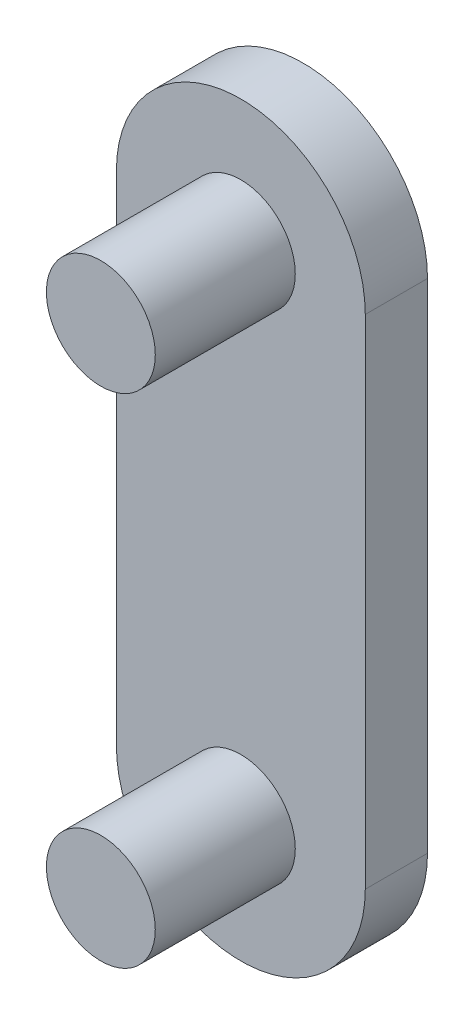
ISO-10303-21;
HEADER;
FILE_DESCRIPTION(('STEP AP214'),'2;1');
FILE_NAME('part.step','',(''),(''),'','','');
FILE_SCHEMA(('AUTOMOTIVE_DESIGN { 1 0 10303 214 1 1 1 1 }'));
ENDSEC;
DATA;
#1=APPLICATION_CONTEXT('core data for automotive mechanical design processes');
#2=APPLICATION_PROTOCOL_DEFINITION('international standard','automotive_design',2000,#1);
#3=PRODUCT_CONTEXT('',#1,'mechanical');
#4=PRODUCT('Part','Part','',(#3));
#5=PRODUCT_RELATED_PRODUCT_CATEGORY('part','',(#4));
#6=PRODUCT_DEFINITION_FORMATION('','',#4);
#7=PRODUCT_DEFINITION_CONTEXT('part definition',#1,'design');
#8=PRODUCT_DEFINITION('design','',#6,#7);
#9=PRODUCT_DEFINITION_SHAPE('','',#8);
#10=(LENGTH_UNIT() NAMED_UNIT(*) SI_UNIT(.MILLI.,.METRE.));
#11=(NAMED_UNIT(*) PLANE_ANGLE_UNIT() SI_UNIT($,.RADIAN.));
#12=(NAMED_UNIT(*) SI_UNIT($,.STERADIAN.) SOLID_ANGLE_UNIT());
#13=UNCERTAINTY_MEASURE_WITH_UNIT(LENGTH_MEASURE(1.E-05),#10,'distance_accuracy_value','');
#14=(GEOMETRIC_REPRESENTATION_CONTEXT(3) GLOBAL_UNCERTAINTY_ASSIGNED_CONTEXT((#13)) GLOBAL_UNIT_ASSIGNED_CONTEXT((#10,
#11,#12)) REPRESENTATION_CONTEXT('',''));
#15=CARTESIAN_POINT('',(0.,0.,0.));
#16=DIRECTION('',(0.,0.,1.));
#17=DIRECTION('',(1.,0.,0.));
#18=AXIS2_PLACEMENT_3D('',#15,#16,#17);
#19=CARTESIAN_POINT('',(-4.,0.,-2.));
#20=DIRECTION('',(-1.,0.,0.));
#21=DIRECTION('',(0.,-1.,0.));
#22=AXIS2_PLACEMENT_3D('',#19,#20,#21);
#23=PLANE('',#22);
#24=DIRECTION('',(0.,-1.,0.));
#25=VECTOR('',#24,1.);
#26=CARTESIAN_POINT('',(-4.,0.,0.));
#27=LINE('',#26,#25);
#28=CARTESIAN_POINT('',(-4.,0.,0.));
#29=VERTEX_POINT('',#28);
#30=CARTESIAN_POINT('',(-4.,-16.,0.));
#31=VERTEX_POINT('',#30);
#32=EDGE_CURVE('E134',#29,#31,#27,.T.);
#33=ORIENTED_EDGE('',*,*,#32,.F.);
#34=DIRECTION('',(0.,0.,1.));
#35=VECTOR('',#34,1.);
#36=CARTESIAN_POINT('',(-4.,0.,-2.));
#37=LINE('',#36,#35);
#38=CARTESIAN_POINT('',(-4.,0.,-2.));
#39=VERTEX_POINT('',#38);
#40=EDGE_CURVE('E12',#39,#29,#37,.T.);
#41=ORIENTED_EDGE('',*,*,#40,.F.);
#42=DIRECTION('',(0.,-1.,0.));
#43=VECTOR('',#42,1.);
#44=CARTESIAN_POINT('',(-4.,0.,-2.));
#45=LINE('',#44,#43);
#46=CARTESIAN_POINT('',(-4.,-16.,-2.));
#47=VERTEX_POINT('',#46);
#48=EDGE_CURVE('E128',#39,#47,#45,.T.);
#49=ORIENTED_EDGE('',*,*,#48,.T.);
#50=DIRECTION('',(0.,0.,1.));
#51=VECTOR('',#50,1.);
#52=CARTESIAN_POINT('',(-4.,-16.,-2.));
#53=LINE('',#52,#51);
#54=EDGE_CURVE('E106',#47,#31,#53,.T.);
#55=ORIENTED_EDGE('',*,*,#54,.T.);
#56=EDGE_LOOP('',(#33,#41,#49,#55));
#57=FACE_BOUND('',#56,.T.);
#58=ADVANCED_FACE('F62',(#57),#23,.T.);
#59=CARTESIAN_POINT('',(4.,0.,-2.));
#60=DIRECTION('',(-1.,0.,0.));
#61=DIRECTION('',(0.,-1.,0.));
#62=AXIS2_PLACEMENT_3D('',#59,#60,#61);
#63=PLANE('',#62);
#64=DIRECTION('',(0.,-1.,0.));
#65=VECTOR('',#64,1.);
#66=CARTESIAN_POINT('',(4.,0.,0.));
#67=LINE('',#66,#65);
#68=CARTESIAN_POINT('',(4.,0.,0.));
#69=VERTEX_POINT('',#68);
#70=CARTESIAN_POINT('',(4.,-16.,0.));
#71=VERTEX_POINT('',#70);
#72=EDGE_CURVE('E122',#69,#71,#67,.T.);
#73=ORIENTED_EDGE('',*,*,#72,.T.);
#74=DIRECTION('',(0.,0.,1.));
#75=VECTOR('',#74,1.);
#76=CARTESIAN_POINT('',(4.,-16.,-2.));
#77=LINE('',#76,#75);
#78=CARTESIAN_POINT('',(4.,-16.,-2.));
#79=VERTEX_POINT('',#78);
#80=EDGE_CURVE('E119',#79,#71,#77,.T.);
#81=ORIENTED_EDGE('',*,*,#80,.F.);
#82=DIRECTION('',(0.,-1.,0.));
#83=VECTOR('',#82,1.);
#84=CARTESIAN_POINT('',(4.,0.,-2.));
#85=LINE('',#84,#83);
#86=CARTESIAN_POINT('',(4.,0.,-2.));
#87=VERTEX_POINT('',#86);
#88=EDGE_CURVE('E111',#87,#79,#85,.T.);
#89=ORIENTED_EDGE('',*,*,#88,.F.);
#90=DIRECTION('',(0.,0.,1.));
#91=VECTOR('',#90,1.);
#92=CARTESIAN_POINT('',(4.,0.,-2.));
#93=LINE('',#92,#91);
#94=EDGE_CURVE('E73',#87,#69,#93,.T.);
#95=ORIENTED_EDGE('',*,*,#94,.T.);
#96=EDGE_LOOP('',(#73,#81,#89,#95));
#97=FACE_BOUND('',#96,.T.);
#98=ADVANCED_FACE('F120',(#97),#63,.F.);
#99=CARTESIAN_POINT('',(0.,-16.,-2.));
#100=DIRECTION('',(0.,0.,1.));
#101=DIRECTION('',(1.,0.,0.));
#102=AXIS2_PLACEMENT_3D('',#99,#100,#101);
#103=CYLINDRICAL_SURFACE('',#102,4.);
#104=CARTESIAN_POINT('',(0.,-16.,0.));
#105=DIRECTION('',(0.,0.,1.));
#106=DIRECTION('',(1.,0.,0.));
#107=AXIS2_PLACEMENT_3D('',#104,#105,#106);
#108=CIRCLE('',#107,4.);
#109=EDGE_CURVE('E138',#31,#71,#108,.T.);
#110=ORIENTED_EDGE('',*,*,#109,.F.);
#111=ORIENTED_EDGE('',*,*,#54,.F.);
#112=CARTESIAN_POINT('',(0.,-16.,-2.));
#113=DIRECTION('',(0.,0.,1.));
#114=DIRECTION('',(1.,0.,0.));
#115=AXIS2_PLACEMENT_3D('',#112,#113,#114);
#116=CIRCLE('',#115,4.);
#117=EDGE_CURVE('E115',#47,#79,#116,.T.);
#118=ORIENTED_EDGE('',*,*,#117,.T.);
#119=ORIENTED_EDGE('',*,*,#80,.T.);
#120=EDGE_LOOP('',(#110,#111,#118,#119));
#121=FACE_BOUND('',#120,.T.);
#122=ADVANCED_FACE('F126',(#121),#103,.T.);
#123=CARTESIAN_POINT('',(0.,0.,-2.));
#124=DIRECTION('',(0.,0.,1.));
#125=DIRECTION('',(1.,0.,0.));
#126=AXIS2_PLACEMENT_3D('',#123,#124,#125);
#127=PLANE('',#126);
#128=ORIENTED_EDGE('',*,*,#48,.F.);
#129=CARTESIAN_POINT('',(0.,0.,-2.));
#130=DIRECTION('',(0.,0.,1.));
#131=DIRECTION('',(1.,0.,0.));
#132=AXIS2_PLACEMENT_3D('',#129,#130,#131);
#133=CIRCLE('',#132,4.);
#134=EDGE_CURVE('E116',#87,#39,#133,.T.);
#135=ORIENTED_EDGE('',*,*,#134,.F.);
#136=ORIENTED_EDGE('',*,*,#88,.T.);
#137=ORIENTED_EDGE('',*,*,#117,.F.);
#138=EDGE_LOOP('',(#128,#135,#136,#137));
#139=FACE_BOUND('',#138,.T.);
#140=ADVANCED_FACE('F114',(#139),#127,.F.);
#141=CARTESIAN_POINT('',(0.,0.,0.));
#142=DIRECTION('',(0.,0.,1.));
#143=DIRECTION('',(1.,0.,0.));
#144=AXIS2_PLACEMENT_3D('',#141,#142,#143);
#145=PLANE('',#144);
#146=CARTESIAN_POINT('',(0.,-16.,0.));
#147=DIRECTION('',(0.,0.,1.));
#148=DIRECTION('',(1.,0.,0.));
#149=AXIS2_PLACEMENT_3D('',#146,#147,#148);
#150=CIRCLE('',#149,1.75);
#151=CARTESIAN_POINT('',(1.75,-16.,0.));
#152=VERTEX_POINT('',#151);
#153=EDGE_CURVE('E160',#152,#152,#150,.T.);
#154=ORIENTED_EDGE('',*,*,#153,.F.);
#155=EDGE_LOOP('',(#154));
#156=FACE_BOUND('',#155,.T.);
#157=CARTESIAN_POINT('',(0.,0.,0.));
#158=DIRECTION('',(0.,0.,1.));
#159=DIRECTION('',(1.,0.,0.));
#160=AXIS2_PLACEMENT_3D('',#157,#158,#159);
#161=CIRCLE('',#160,1.75);
#162=CARTESIAN_POINT('',(1.75,0.,0.));
#163=VERTEX_POINT('',#162);
#164=EDGE_CURVE('E152',#163,#163,#161,.T.);
#165=ORIENTED_EDGE('',*,*,#164,.F.);
#166=EDGE_LOOP('',(#165));
#167=FACE_BOUND('',#166,.T.);
#168=ORIENTED_EDGE('',*,*,#32,.T.);
#169=ORIENTED_EDGE('',*,*,#109,.T.);
#170=ORIENTED_EDGE('',*,*,#72,.F.);
#171=CARTESIAN_POINT('',(0.,0.,0.));
#172=DIRECTION('',(0.,0.,1.));
#173=DIRECTION('',(1.,0.,0.));
#174=AXIS2_PLACEMENT_3D('',#171,#172,#173);
#175=CIRCLE('',#174,4.);
#176=EDGE_CURVE('E66',#69,#29,#175,.T.);
#177=ORIENTED_EDGE('',*,*,#176,.T.);
#178=EDGE_LOOP('',(#168,#169,#170,#177));
#179=FACE_BOUND('',#178,.T.);
#180=ADVANCED_FACE('F177',(#156,#167,#179),#145,.T.);
#181=CARTESIAN_POINT('',(0.,0.,-2.));
#182=DIRECTION('',(0.,0.,1.));
#183=DIRECTION('',(1.,0.,0.));
#184=AXIS2_PLACEMENT_3D('',#181,#182,#183);
#185=CYLINDRICAL_SURFACE('',#184,4.);
#186=ORIENTED_EDGE('',*,*,#134,.T.);
#187=ORIENTED_EDGE('',*,*,#40,.T.);
#188=ORIENTED_EDGE('',*,*,#176,.F.);
#189=ORIENTED_EDGE('',*,*,#94,.F.);
#190=EDGE_LOOP('',(#186,#187,#188,#189));
#191=FACE_BOUND('',#190,.T.);
#192=ADVANCED_FACE('F64',(#191),#185,.T.);
#193=CARTESIAN_POINT('',(0.,0.,4.5));
#194=DIRECTION('',(0.,0.,-1.));
#195=DIRECTION('',(-1.,0.,0.));
#196=AXIS2_PLACEMENT_3D('',#193,#194,#195);
#197=CYLINDRICAL_SURFACE('',#196,1.75);
#198=CARTESIAN_POINT('',(0.,0.,4.5));
#199=DIRECTION('',(0.,0.,1.));
#200=DIRECTION('',(1.,0.,0.));
#201=AXIS2_PLACEMENT_3D('',#198,#199,#200);
#202=CIRCLE('',#201,1.75);
#203=CARTESIAN_POINT('',(1.75,0.,4.5));
#204=VERTEX_POINT('',#203);
#205=EDGE_CURVE('E148',#204,#204,#202,.T.);
#206=ORIENTED_EDGE('',*,*,#205,.F.);
#207=EDGE_LOOP('',(#206));
#208=FACE_BOUND('',#207,.T.);
#209=ORIENTED_EDGE('',*,*,#164,.T.);
#210=EDGE_LOOP('',(#209));
#211=FACE_BOUND('',#210,.T.);
#212=ADVANCED_FACE('F181',(#208,#211),#197,.T.);
#213=CARTESIAN_POINT('',(0.,0.,4.5));
#214=DIRECTION('',(0.,0.,1.));
#215=DIRECTION('',(1.,0.,0.));
#216=AXIS2_PLACEMENT_3D('',#213,#214,#215);
#217=PLANE('',#216);
#218=ORIENTED_EDGE('',*,*,#205,.T.);
#219=EDGE_LOOP('',(#218));
#220=FACE_BOUND('',#219,.T.);
#221=ADVANCED_FACE('F173',(#220),#217,.T.);
#222=CARTESIAN_POINT('',(0.,-16.,4.5));
#223=DIRECTION('',(0.,0.,-1.));
#224=DIRECTION('',(-1.,0.,0.));
#225=AXIS2_PLACEMENT_3D('',#222,#223,#224);
#226=CYLINDRICAL_SURFACE('',#225,1.75);
#227=CARTESIAN_POINT('',(0.,-16.,4.5));
#228=DIRECTION('',(0.,0.,1.));
#229=DIRECTION('',(1.,0.,0.));
#230=AXIS2_PLACEMENT_3D('',#227,#228,#229);
#231=CIRCLE('',#230,1.75);
#232=CARTESIAN_POINT('',(1.75,-16.,4.5));
#233=VERTEX_POINT('',#232);
#234=EDGE_CURVE('E158',#233,#233,#231,.T.);
#235=ORIENTED_EDGE('',*,*,#234,.F.);
#236=EDGE_LOOP('',(#235));
#237=FACE_BOUND('',#236,.T.);
#238=ORIENTED_EDGE('',*,*,#153,.T.);
#239=EDGE_LOOP('',(#238));
#240=FACE_BOUND('',#239,.T.);
#241=ADVANCED_FACE('F170',(#237,#240),#226,.T.);
#242=CARTESIAN_POINT('',(0.,0.,4.5));
#243=DIRECTION('',(0.,0.,1.));
#244=DIRECTION('',(1.,0.,0.));
#245=AXIS2_PLACEMENT_3D('',#242,#243,#244);
#246=PLANE('',#245);
#247=ORIENTED_EDGE('',*,*,#234,.T.);
#248=EDGE_LOOP('',(#247));
#249=FACE_BOUND('',#248,.T.);
#250=ADVANCED_FACE('F168',(#249),#246,.T.);
#251=CLOSED_SHELL('',(#58,#98,#122,#140,#180,#192,#212,#221,#241,#250));
#252=MANIFOLD_SOLID_BREP('B2',#251);
#253=ADVANCED_BREP_SHAPE_REPRESENTATION('',(#18,#252),#14);
#254=SHAPE_DEFINITION_REPRESENTATION(#9,#253);
ENDSEC;
END-ISO-10303-21;
